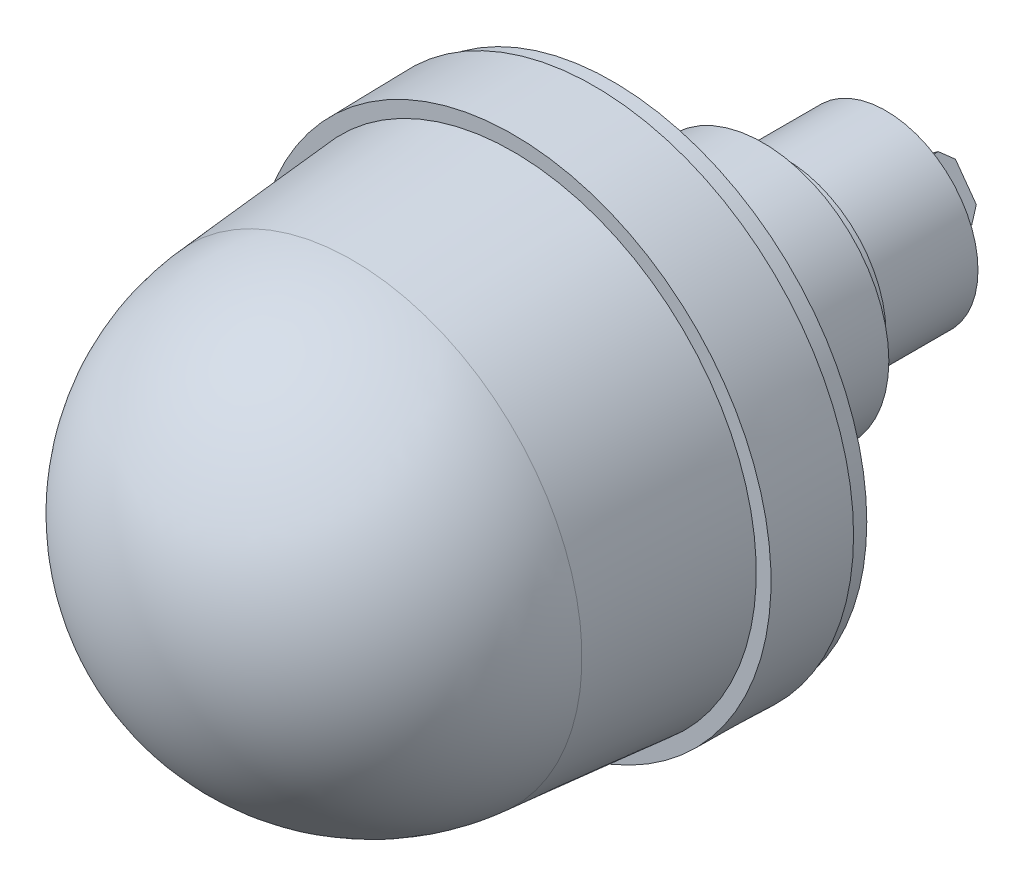
ISO-10303-21;
HEADER;
FILE_DESCRIPTION(('STEP AP214'),'2;1');
FILE_NAME('part.step','',(''),(''),'','','');
FILE_SCHEMA(('AUTOMOTIVE_DESIGN { 1 0 10303 214 1 1 1 1 }'));
ENDSEC;
DATA;
#1=APPLICATION_CONTEXT('core data for automotive mechanical design processes');
#2=APPLICATION_PROTOCOL_DEFINITION('international standard','automotive_design',2000,#1);
#3=PRODUCT_CONTEXT('',#1,'mechanical');
#4=PRODUCT('Part','Part','',(#3));
#5=PRODUCT_RELATED_PRODUCT_CATEGORY('part','',(#4));
#6=PRODUCT_DEFINITION_FORMATION('','',#4);
#7=PRODUCT_DEFINITION_CONTEXT('part definition',#1,'design');
#8=PRODUCT_DEFINITION('design','',#6,#7);
#9=PRODUCT_DEFINITION_SHAPE('','',#8);
#10=(LENGTH_UNIT() NAMED_UNIT(*) SI_UNIT(.MILLI.,.METRE.));
#11=(NAMED_UNIT(*) PLANE_ANGLE_UNIT() SI_UNIT($,.RADIAN.));
#12=(NAMED_UNIT(*) SI_UNIT($,.STERADIAN.) SOLID_ANGLE_UNIT());
#13=UNCERTAINTY_MEASURE_WITH_UNIT(LENGTH_MEASURE(1.E-05),#10,'distance_accuracy_value','');
#14=(GEOMETRIC_REPRESENTATION_CONTEXT(3) GLOBAL_UNCERTAINTY_ASSIGNED_CONTEXT((#13)) GLOBAL_UNIT_ASSIGNED_CONTEXT((#10,
#11,#12)) REPRESENTATION_CONTEXT('',''));
#15=CARTESIAN_POINT('',(0.,0.,0.));
#16=DIRECTION('',(0.,0.,1.));
#17=DIRECTION('',(1.,0.,0.));
#18=AXIS2_PLACEMENT_3D('',#15,#16,#17);
#19=CARTESIAN_POINT('',(0.,5.05,-29.));
#20=DIRECTION('',(0.,0.,-1.));
#21=DIRECTION('',(-1.,0.,0.));
#22=AXIS2_PLACEMENT_3D('',#19,#20,#21);
#23=PLANE('',#22);
#24=CARTESIAN_POINT('',(0.,0.,-29.));
#25=DIRECTION('',(0.,0.,1.));
#26=DIRECTION('',(1.,0.,0.));
#27=AXIS2_PLACEMENT_3D('',#24,#25,#26);
#28=CIRCLE('',#27,10.1);
#29=CARTESIAN_POINT('',(10.1,0.,-29.));
#30=VERTEX_POINT('',#29);
#31=EDGE_CURVE('E237',#30,#30,#28,.T.);
#32=ORIENTED_EDGE('',*,*,#31,.F.);
#33=EDGE_LOOP('',(#32));
#34=FACE_BOUND('',#33,.T.);
#35=DIRECTION('',(0.585540483323654,-0.810643165880711,0.));
#36=VECTOR('',#35,1.);
#37=CARTESIAN_POINT('',(-3.76949072134531,-2.72276324745501,-29.));
#38=LINE('',#37,#36);
#39=CARTESIAN_POINT('',(-5.61394324381483,-0.16923727493077,-29.));
#40=VERTEX_POINT('',#39);
#41=CARTESIAN_POINT('',(-1.92503819887581,-5.27628921997925,-29.));
#42=VERTEX_POINT('',#41);
#43=EDGE_CURVE('E172',#40,#42,#38,.T.);
#44=ORIENTED_EDGE('',*,*,#43,.T.);
#45=DIRECTION('',(0.810643165880711,0.585540483323654,0.));
#46=VECTOR('',#45,1.);
#47=CARTESIAN_POINT('',(-1.60078093252352,-5.04207302664979,-29.));
#48=LINE('',#47,#46);
#49=CARTESIAN_POINT('',(-1.27652366617123,-4.80785683332033,-29.));
#50=VERTEX_POINT('',#49);
#51=EDGE_CURVE('E168',#42,#50,#48,.T.);
#52=ORIENTED_EDGE('',*,*,#51,.T.);
#53=DIRECTION('',(-0.585540483323654,0.810643165880711,0.));
#54=VECTOR('',#53,1.);
#55=CARTESIAN_POINT('',(-3.12097618864074,-2.25433086079609,-29.));
#56=LINE('',#55,#54);
#57=CARTESIAN_POINT('',(-4.96542871111025,0.299195111728155,-29.));
#58=VERTEX_POINT('',#57);
#59=EDGE_CURVE('E181',#50,#58,#56,.T.);
#60=ORIENTED_EDGE('',*,*,#59,.T.);
#61=DIRECTION('',(-0.810643165880711,-0.585540483323654,0.));
#62=VECTOR('',#61,1.);
#63=CARTESIAN_POINT('',(-5.28968597746254,0.0649789183986918,-29.));
#64=LINE('',#63,#62);
#65=EDGE_CURVE('E177',#58,#40,#64,.T.);
#66=ORIENTED_EDGE('',*,*,#65,.T.);
#67=EDGE_LOOP('',(#44,#52,#60,#66));
#68=FACE_BOUND('',#67,.T.);
#69=DIRECTION('',(0.810643165880711,0.585540483323654,0.));
#70=VECTOR('',#69,1.);
#71=CARTESIAN_POINT('',(1.60078093252353,5.04207302664977,-29.));
#72=LINE('',#71,#70);
#73=CARTESIAN_POINT('',(1.27652366617125,4.80785683332031,-29.));
#74=VERTEX_POINT('',#73);
#75=CARTESIAN_POINT('',(1.92503819887582,5.27628921997923,-29.));
#76=VERTEX_POINT('',#75);
#77=EDGE_CURVE('E138',#74,#76,#72,.T.);
#78=ORIENTED_EDGE('',*,*,#77,.F.);
#79=DIRECTION('',(-0.585540483323654,0.810643165880711,0.));
#80=VECTOR('',#79,1.);
#81=CARTESIAN_POINT('',(3.12097618864076,2.25433086079607,-29.));
#82=LINE('',#81,#80);
#83=CARTESIAN_POINT('',(4.96542871111027,-0.299195111728172,-29.));
#84=VERTEX_POINT('',#83);
#85=EDGE_CURVE('E118',#84,#74,#82,.T.);
#86=ORIENTED_EDGE('',*,*,#85,.F.);
#87=DIRECTION('',(-0.810643165880711,-0.585540483323654,0.));
#88=VECTOR('',#87,1.);
#89=CARTESIAN_POINT('',(5.28968597746255,-0.064978918398709,-29.));
#90=LINE('',#89,#88);
#91=CARTESIAN_POINT('',(5.61394324381484,0.169237274930753,-29.));
#92=VERTEX_POINT('',#91);
#93=EDGE_CURVE('E125',#92,#84,#90,.T.);
#94=ORIENTED_EDGE('',*,*,#93,.F.);
#95=DIRECTION('',(0.585540483323654,-0.810643165880711,0.));
#96=VECTOR('',#95,1.);
#97=CARTESIAN_POINT('',(3.76949072134533,2.72276324745499,-29.));
#98=LINE('',#97,#96);
#99=EDGE_CURVE('E135',#76,#92,#98,.T.);
#100=ORIENTED_EDGE('',*,*,#99,.F.);
#101=EDGE_LOOP('',(#78,#86,#94,#100));
#102=FACE_BOUND('',#101,.T.);
#103=ADVANCED_FACE('F17',(#34,#68,#102),#23,.T.);
#104=CARTESIAN_POINT('',(0.,14.2249999999556,2.99999999999835));
#105=DIRECTION('',(0.,0.,1.));
#106=DIRECTION('',(1.,0.,0.));
#107=AXIS2_PLACEMENT_3D('',#104,#105,#106);
#108=PLANE('',#107);
#109=CARTESIAN_POINT('',(0.,0.,2.99999999999835));
#110=DIRECTION('',(0.,0.,1.));
#111=DIRECTION('',(1.,0.,0.));
#112=AXIS2_PLACEMENT_3D('',#109,#110,#111);
#113=CIRCLE('',#112,27.9);
#114=CARTESIAN_POINT('',(27.9,0.,2.99999999999835));
#115=VERTEX_POINT('',#114);
#116=EDGE_CURVE('E241',#115,#115,#113,.T.);
#117=ORIENTED_EDGE('',*,*,#116,.T.);
#118=EDGE_LOOP('',(#117));
#119=FACE_BOUND('',#118,.T.);
#120=CARTESIAN_POINT('',(0.,0.,2.99999999999835));
#121=DIRECTION('',(0.,0.,-1.));
#122=DIRECTION('',(-1.,0.,0.));
#123=AXIS2_PLACEMENT_3D('',#120,#121,#122);
#124=CIRCLE('',#123,28.4499999999113);
#125=CARTESIAN_POINT('',(-28.4499999999113,0.,2.99999999999835));
#126=VERTEX_POINT('',#125);
#127=EDGE_CURVE('E257',#126,#126,#124,.T.);
#128=ORIENTED_EDGE('',*,*,#127,.T.);
#129=EDGE_LOOP('',(#128));
#130=FACE_BOUND('',#129,.T.);
#131=ADVANCED_FACE('F334',(#119,#130),#108,.F.);
#132=CARTESIAN_POINT('',(0.,0.,11.8999999999291));
#133=DIRECTION('',(0.,0.,-1.));
#134=DIRECTION('',(-1.,0.,0.));
#135=AXIS2_PLACEMENT_3D('',#132,#133,#134);
#136=CONICAL_SURFACE('',#135,28.2946499221511,0.0174532925087362);
#137=ORIENTED_EDGE('',*,*,#127,.F.);
#138=EDGE_LOOP('',(#137));
#139=FACE_BOUND('',#138,.T.);
#140=CARTESIAN_POINT('',(0.,0.,11.8999999999291));
#141=DIRECTION('',(0.,0.,-1.));
#142=DIRECTION('',(-1.,0.,0.));
#143=AXIS2_PLACEMENT_3D('',#140,#141,#142);
#144=CIRCLE('',#143,28.2946499221511);
#145=CARTESIAN_POINT('',(-28.2946499221511,0.,11.8999999999291));
#146=VERTEX_POINT('',#145);
#147=EDGE_CURVE('E253',#146,#146,#144,.T.);
#148=ORIENTED_EDGE('',*,*,#147,.T.);
#149=EDGE_LOOP('',(#148));
#150=FACE_BOUND('',#149,.T.);
#151=ADVANCED_FACE('F341',(#139,#150),#136,.T.);
#152=CARTESIAN_POINT('',(0.,27.4848249606536,11.8999999999291));
#153=DIRECTION('',(0.,0.,-1.));
#154=DIRECTION('',(-1.,0.,0.));
#155=AXIS2_PLACEMENT_3D('',#152,#153,#154);
#156=PLANE('',#155);
#157=ORIENTED_EDGE('',*,*,#147,.F.);
#158=EDGE_LOOP('',(#157));
#159=FACE_BOUND('',#158,.T.);
#160=CARTESIAN_POINT('',(0.,0.,11.8999999999291));
#161=DIRECTION('',(0.,0.,-1.));
#162=DIRECTION('',(-1.,0.,0.));
#163=AXIS2_PLACEMENT_3D('',#160,#161,#162);
#164=CIRCLE('',#163,26.6749999991561);
#165=CARTESIAN_POINT('',(-26.6749999991561,0.,11.8999999999291));
#166=VERTEX_POINT('',#165);
#167=EDGE_CURVE('E249',#166,#166,#164,.T.);
#168=ORIENTED_EDGE('',*,*,#167,.T.);
#169=EDGE_LOOP('',(#168));
#170=FACE_BOUND('',#169,.T.);
#171=ADVANCED_FACE('F361',(#159,#170),#156,.F.);
#172=CARTESIAN_POINT('',(0.,0.,29.5326089875493));
#173=DIRECTION('',(0.,0.,-1.));
#174=DIRECTION('',(-1.,0.,0.));
#175=AXIS2_PLACEMENT_3D('',#172,#173,#174);
#176=CONICAL_SURFACE('',#175,25.1821970036568,0.084460085717178);
#177=ORIENTED_EDGE('',*,*,#167,.F.);
#178=EDGE_LOOP('',(#177));
#179=FACE_BOUND('',#178,.T.);
#180=CARTESIAN_POINT('',(0.,0.,29.5326089875493));
#181=DIRECTION('',(0.,0.,-1.));
#182=DIRECTION('',(-1.,0.,0.));
#183=AXIS2_PLACEMENT_3D('',#180,#181,#182);
#184=CIRCLE('',#183,25.1821970036568);
#185=CARTESIAN_POINT('',(-25.1821970036568,0.,29.5326089875493));
#186=VERTEX_POINT('',#185);
#187=EDGE_CURVE('E245',#186,#186,#184,.T.);
#188=ORIENTED_EDGE('',*,*,#187,.T.);
#189=EDGE_LOOP('',(#188));
#190=FACE_BOUND('',#189,.T.);
#191=ADVANCED_FACE('F357',(#179,#190),#176,.T.);
#192=CARTESIAN_POINT('',(0.0294772823733194,0.,27.3981510112985));
#193=DIRECTION('',(0.,-1.,0.));
#194=DIRECTION('',(-1.,0.,0.));
#195=AXIS2_PLACEMENT_3D('',#192,#193,#194);
#196=CIRCLE('',#195,25.3018661595791);
#197=TRIMMED_CURVE('',#196,(PARAMETER_VALUE(-1.56963130248975)),
(PARAMETER_VALUE(1.56963130248975)),.T.,.PARAMETER.);
#198=CARTESIAN_POINT('',(0.,0.,27.3981510112985));
#199=DIRECTION('',(0.,0.,-1.));
#200=AXIS1_PLACEMENT('',#198,#199);
#201=SURFACE_OF_REVOLUTION('',#197,#200);
#202=CARTESIAN_POINT('',(0.,0.,52.7));
#203=VERTEX_POINT('',#202);
#204=VERTEX_LOOP('',#203);
#205=FACE_BOUND('',#204,.T.);
#206=ORIENTED_EDGE('',*,*,#187,.F.);
#207=EDGE_LOOP('',(#206));
#208=FACE_BOUND('',#207,.T.);
#209=ADVANCED_FACE('F353',(#205,#208),#201,.T.);
#210=CARTESIAN_POINT('',(0.,0.,-13.0000000000008));
#211=DIRECTION('',(0.,0.,1.));
#212=DIRECTION('',(1.,0.,0.));
#213=AXIS2_PLACEMENT_3D('',#210,#211,#212);
#214=CYLINDRICAL_SURFACE('',#213,27.9);
#215=CARTESIAN_POINT('',(0.,0.,1.));
#216=DIRECTION('',(0.,0.,1.));
#217=DIRECTION('',(1.,0.,0.));
#218=AXIS2_PLACEMENT_3D('',#215,#216,#217);
#219=CIRCLE('',#218,27.9);
#220=CARTESIAN_POINT('',(27.9,0.,1.));
#221=VERTEX_POINT('',#220);
#222=EDGE_CURVE('E185',#221,#221,#219,.T.);
#223=ORIENTED_EDGE('',*,*,#222,.T.);
#224=EDGE_LOOP('',(#223));
#225=FACE_BOUND('',#224,.T.);
#226=ORIENTED_EDGE('',*,*,#116,.F.);
#227=EDGE_LOOP('',(#226));
#228=FACE_BOUND('',#227,.T.);
#229=ADVANCED_FACE('F350',(#225,#228),#214,.T.);
#230=CARTESIAN_POINT('',(0.,0.,-13.0000000000008));
#231=DIRECTION('',(0.,0.,1.));
#232=DIRECTION('',(1.,0.,0.));
#233=AXIS2_PLACEMENT_3D('',#230,#231,#232);
#234=CYLINDRICAL_SURFACE('',#233,10.1000000002019);
#235=ORIENTED_EDGE('',*,*,#31,.T.);
#236=EDGE_LOOP('',(#235));
#237=FACE_BOUND('',#236,.T.);
#238=CARTESIAN_POINT('',(0.,0.,-18.0000000004038));
#239=DIRECTION('',(0.,0.,1.));
#240=DIRECTION('',(1.,0.,0.));
#241=AXIS2_PLACEMENT_3D('',#238,#239,#240);
#242=CIRCLE('',#241,10.1000000004038);
#243=CARTESIAN_POINT('',(10.1000000004038,0.,-18.0000000004038));
#244=VERTEX_POINT('',#243);
#245=EDGE_CURVE('E233',#244,#244,#242,.T.);
#246=ORIENTED_EDGE('',*,*,#245,.F.);
#247=EDGE_LOOP('',(#246));
#248=FACE_BOUND('',#247,.T.);
#249=ADVANCED_FACE('F348',(#237,#248),#234,.T.);
#250=CARTESIAN_POINT('',(0.,10.5500000002019,-18.0000000004038));
#251=DIRECTION('',(0.,0.,-1.));
#252=DIRECTION('',(-1.,0.,0.));
#253=AXIS2_PLACEMENT_3D('',#250,#251,#252);
#254=PLANE('',#253);
#255=ORIENTED_EDGE('',*,*,#245,.T.);
#256=EDGE_LOOP('',(#255));
#257=FACE_BOUND('',#256,.T.);
#258=CARTESIAN_POINT('',(0.,0.,-18.0000000004038));
#259=DIRECTION('',(0.,0.,1.));
#260=DIRECTION('',(1.,0.,0.));
#261=AXIS2_PLACEMENT_3D('',#258,#259,#260);
#262=CIRCLE('',#261,11.);
#263=CARTESIAN_POINT('',(11.,0.,-18.0000000004038));
#264=VERTEX_POINT('',#263);
#265=EDGE_CURVE('E229',#264,#264,#262,.T.);
#266=ORIENTED_EDGE('',*,*,#265,.F.);
#267=EDGE_LOOP('',(#266));
#268=FACE_BOUND('',#267,.T.);
#269=ADVANCED_FACE('F452',(#257,#268),#254,.T.);
#270=CARTESIAN_POINT('',(0.,0.,-13.0000000000008));
#271=DIRECTION('',(0.,0.,1.));
#272=DIRECTION('',(1.,0.,0.));
#273=AXIS2_PLACEMENT_3D('',#270,#271,#272);
#274=CYLINDRICAL_SURFACE('',#273,11.);
#275=ORIENTED_EDGE('',*,*,#265,.T.);
#276=EDGE_LOOP('',(#275));
#277=FACE_BOUND('',#276,.T.);
#278=CARTESIAN_POINT('',(0.,0.,-15.5));
#279=DIRECTION('',(0.,0.,1.));
#280=DIRECTION('',(1.,0.,0.));
#281=AXIS2_PLACEMENT_3D('',#278,#279,#280);
#282=CIRCLE('',#281,11.);
#283=CARTESIAN_POINT('',(11.,0.,-15.5));
#284=VERTEX_POINT('',#283);
#285=EDGE_CURVE('E225',#284,#284,#282,.T.);
#286=ORIENTED_EDGE('',*,*,#285,.F.);
#287=EDGE_LOOP('',(#286));
#288=FACE_BOUND('',#287,.T.);
#289=ADVANCED_FACE('F449',(#277,#288),#274,.T.);
#290=CARTESIAN_POINT('',(0.,12.4098214285714,-15.5));
#291=DIRECTION('',(0.,0.,-1.));
#292=DIRECTION('',(-1.,0.,0.));
#293=AXIS2_PLACEMENT_3D('',#290,#291,#292);
#294=PLANE('',#293);
#295=ORIENTED_EDGE('',*,*,#285,.T.);
#296=EDGE_LOOP('',(#295));
#297=FACE_BOUND('',#296,.T.);
#298=CARTESIAN_POINT('',(0.,0.,-15.5));
#299=DIRECTION('',(0.,0.,1.));
#300=DIRECTION('',(1.,0.,0.));
#301=AXIS2_PLACEMENT_3D('',#298,#299,#300);
#302=CIRCLE('',#301,13.8196428571428);
#303=CARTESIAN_POINT('',(13.8196428571428,0.,-15.5));
#304=VERTEX_POINT('',#303);
#305=EDGE_CURVE('E222',#304,#304,#302,.T.);
#306=ORIENTED_EDGE('',*,*,#305,.F.);
#307=EDGE_LOOP('',(#306));
#308=FACE_BOUND('',#307,.T.);
#309=ADVANCED_FACE('F445',(#297,#308),#294,.T.);
#310=CARTESIAN_POINT('',(0.,0.,-7.));
#311=DIRECTION('',(0.,0.,1.));
#312=DIRECTION('',(1.,0.,0.));
#313=AXIS2_PLACEMENT_3D('',#310,#311,#312);
#314=CONICAL_SURFACE('',#313,13.8500000000001,0.00357141338691907);
#315=ORIENTED_EDGE('',*,*,#305,.T.);
#316=EDGE_LOOP('',(#315));
#317=FACE_BOUND('',#316,.T.);
#318=CARTESIAN_POINT('',(0.,0.,-7.));
#319=DIRECTION('',(0.,0.,1.));
#320=DIRECTION('',(1.,0.,0.));
#321=AXIS2_PLACEMENT_3D('',#318,#319,#320);
#322=CIRCLE('',#321,13.8500000000001);
#323=CARTESIAN_POINT('',(13.8500000000001,0.,-7.));
#324=VERTEX_POINT('',#323);
#325=EDGE_CURVE('E218',#324,#324,#322,.T.);
#326=ORIENTED_EDGE('',*,*,#325,.F.);
#327=EDGE_LOOP('',(#326));
#328=FACE_BOUND('',#327,.T.);
#329=ADVANCED_FACE('F441',(#317,#328),#314,.T.);
#330=CARTESIAN_POINT('',(0.,12.425,-7.));
#331=DIRECTION('',(0.,0.,1.));
#332=DIRECTION('',(1.,0.,0.));
#333=AXIS2_PLACEMENT_3D('',#330,#331,#332);
#334=PLANE('',#333);
#335=ORIENTED_EDGE('',*,*,#325,.T.);
#336=EDGE_LOOP('',(#335));
#337=FACE_BOUND('',#336,.T.);
#338=CARTESIAN_POINT('',(0.,0.,-7.));
#339=DIRECTION('',(0.,0.,1.));
#340=DIRECTION('',(1.,0.,0.));
#341=AXIS2_PLACEMENT_3D('',#338,#339,#340);
#342=CIRCLE('',#341,11.);
#343=CARTESIAN_POINT('',(11.,0.,-7.));
#344=VERTEX_POINT('',#343);
#345=EDGE_CURVE('E214',#344,#344,#342,.T.);
#346=ORIENTED_EDGE('',*,*,#345,.F.);
#347=EDGE_LOOP('',(#346));
#348=FACE_BOUND('',#347,.T.);
#349=ADVANCED_FACE('F437',(#337,#348),#334,.T.);
#350=CARTESIAN_POINT('',(0.,0.,-13.0000000000008));
#351=DIRECTION('',(0.,0.,1.));
#352=DIRECTION('',(1.,0.,0.));
#353=AXIS2_PLACEMENT_3D('',#350,#351,#352);
#354=CYLINDRICAL_SURFACE('',#353,11.);
#355=ORIENTED_EDGE('',*,*,#345,.T.);
#356=EDGE_LOOP('',(#355));
#357=FACE_BOUND('',#356,.T.);
#358=CARTESIAN_POINT('',(0.,0.,0.));
#359=DIRECTION('',(0.,0.,1.));
#360=DIRECTION('',(1.,0.,0.));
#361=AXIS2_PLACEMENT_3D('',#358,#359,#360);
#362=CIRCLE('',#361,11.);
#363=CARTESIAN_POINT('',(11.,0.,0.));
#364=VERTEX_POINT('',#363);
#365=EDGE_CURVE('E210',#364,#364,#362,.T.);
#366=ORIENTED_EDGE('',*,*,#365,.F.);
#367=EDGE_LOOP('',(#366));
#368=FACE_BOUND('',#367,.T.);
#369=ADVANCED_FACE('F433',(#357,#368),#354,.T.);
#370=CARTESIAN_POINT('',(0.,15.5,0.));
#371=DIRECTION('',(0.,0.,-1.));
#372=DIRECTION('',(-1.,0.,0.));
#373=AXIS2_PLACEMENT_3D('',#370,#371,#372);
#374=PLANE('',#373);
#375=ORIENTED_EDGE('',*,*,#365,.T.);
#376=EDGE_LOOP('',(#375));
#377=FACE_BOUND('',#376,.T.);
#378=CARTESIAN_POINT('',(0.,0.,0.));
#379=DIRECTION('',(0.,0.,1.));
#380=DIRECTION('',(1.,0.,0.));
#381=AXIS2_PLACEMENT_3D('',#378,#379,#380);
#382=CIRCLE('',#381,20.);
#383=CARTESIAN_POINT('',(20.,0.,0.));
#384=VERTEX_POINT('',#383);
#385=EDGE_CURVE('E206',#384,#384,#382,.T.);
#386=ORIENTED_EDGE('',*,*,#385,.F.);
#387=EDGE_LOOP('',(#386));
#388=FACE_BOUND('',#387,.T.);
#389=ADVANCED_FACE('F429',(#377,#388),#374,.T.);
#390=CARTESIAN_POINT('',(0.,0.,-13.0000000000008));
#391=DIRECTION('',(0.,0.,1.));
#392=DIRECTION('',(1.,0.,0.));
#393=AXIS2_PLACEMENT_3D('',#390,#391,#392);
#394=CYLINDRICAL_SURFACE('',#393,20.);
#395=ORIENTED_EDGE('',*,*,#385,.T.);
#396=EDGE_LOOP('',(#395));
#397=FACE_BOUND('',#396,.T.);
#398=CARTESIAN_POINT('',(0.,0.,1.));
#399=DIRECTION('',(0.,0.,1.));
#400=DIRECTION('',(1.,0.,0.));
#401=AXIS2_PLACEMENT_3D('',#398,#399,#400);
#402=CIRCLE('',#401,20.);
#403=CARTESIAN_POINT('',(20.,0.,1.));
#404=VERTEX_POINT('',#403);
#405=EDGE_CURVE('E202',#404,#404,#402,.T.);
#406=ORIENTED_EDGE('',*,*,#405,.F.);
#407=EDGE_LOOP('',(#406));
#408=FACE_BOUND('',#407,.T.);
#409=ADVANCED_FACE('F415',(#397,#408),#394,.T.);
#410=CARTESIAN_POINT('',(0.,23.95,1.));
#411=DIRECTION('',(0.,0.,-1.));
#412=DIRECTION('',(-1.,0.,0.));
#413=AXIS2_PLACEMENT_3D('',#410,#411,#412);
#414=PLANE('',#413);
#415=ORIENTED_EDGE('',*,*,#405,.T.);
#416=EDGE_LOOP('',(#415));
#417=FACE_BOUND('',#416,.T.);
#418=ORIENTED_EDGE('',*,*,#222,.F.);
#419=EDGE_LOOP('',(#418));
#420=FACE_BOUND('',#419,.T.);
#421=ADVANCED_FACE('F408',(#417,#420),#414,.T.);
#422=CARTESIAN_POINT('',(-3.44523345499303,-2.48854705412554,-33.9999999999967));
#423=DIRECTION('',(0.,0.,-1.));
#424=DIRECTION('',(0.,1.,0.));
#425=AXIS2_PLACEMENT_3D('',#422,#423,#424);
#426=PLANE('',#425);
#427=DIRECTION('',(0.585540483323654,-0.810643165880711,0.));
#428=VECTOR('',#427,1.);
#429=CARTESIAN_POINT('',(-3.76949072134531,-2.72276324745501,-33.9999999999967));
#430=LINE('',#429,#428);
#431=CARTESIAN_POINT('',(-4.91492501482305,-1.13698308635916,-33.9999999999967));
#432=VERTEX_POINT('',#431);
#433=CARTESIAN_POINT('',(-2.62405642786759,-4.30854340855086,-33.9999999999967));
#434=VERTEX_POINT('',#433);
#435=EDGE_CURVE('E140',#432,#434,#430,.T.);
#436=ORIENTED_EDGE('',*,*,#435,.F.);
#437=DIRECTION('',(0.810643165880711,0.585540483323654,0.));
#438=VECTOR('',#437,1.);
#439=CARTESIAN_POINT('',(-4.59066774847076,-0.9027668930297,-33.9999999999967));
#440=LINE('',#439,#438);
#441=CARTESIAN_POINT('',(-4.26641048211847,-0.668550699700239,-33.9999999999967));
#442=VERTEX_POINT('',#441);
#443=EDGE_CURVE('E41',#432,#442,#440,.T.);
#444=ORIENTED_EDGE('',*,*,#443,.T.);
#445=DIRECTION('',(-0.585540483323654,0.810643165880711,0.));
#446=VECTOR('',#445,1.);
#447=CARTESIAN_POINT('',(-3.12097618864074,-2.25433086079609,-33.9999999999967));
#448=LINE('',#447,#446);
#449=CARTESIAN_POINT('',(-1.97554189516301,-3.84011102189194,-33.9999999999967));
#450=VERTEX_POINT('',#449);
#451=EDGE_CURVE('E147',#450,#442,#448,.T.);
#452=ORIENTED_EDGE('',*,*,#451,.F.);
#453=DIRECTION('',(-0.810643165880711,-0.585540483323654,0.));
#454=VECTOR('',#453,1.);
#455=CARTESIAN_POINT('',(-2.2997991615153,-4.0743272152214,-33.9999999999967));
#456=LINE('',#455,#454);
#457=EDGE_CURVE('E293',#450,#434,#456,.T.);
#458=ORIENTED_EDGE('',*,*,#457,.T.);
#459=EDGE_LOOP('',(#436,#444,#452,#458));
#460=FACE_BOUND('',#459,.T.);
#461=ADVANCED_FACE('F331',(#460),#426,.T.);
#462=CARTESIAN_POINT('',(-3.76949072134531,-2.72276324745501,-34.0019999999967));
#463=DIRECTION('',(-0.810643165880711,-0.585540483323654,0.));
#464=DIRECTION('',(0.585540483323654,-0.810643165880711,0.));
#465=AXIS2_PLACEMENT_3D('',#462,#463,#464);
#466=PLANE('',#465);
#467=DIRECTION('',(0.,0.,1.));
#468=VECTOR('',#467,1.);
#469=CARTESIAN_POINT('',(-5.61394324381483,-0.16923727493077,-34.0019999999967));
#470=LINE('',#469,#468);
#471=CARTESIAN_POINT('',(-5.61394324381483,-0.16923727493077,-32.8061999999967));
#472=VERTEX_POINT('',#471);
#473=EDGE_CURVE('E191',#472,#40,#470,.T.);
#474=ORIENTED_EDGE('',*,*,#473,.F.);
#475=DIRECTION('',(-0.414039646417404,0.573211279716782,0.707106781186548));
#476=VECTOR('',#475,1.);
#477=CARTESIAN_POINT('',(-4.34162232760085,-1.93068381007297,-34.9790999999967));
#478=LINE('',#477,#476);
#479=EDGE_CURVE('E290',#472,#432,#478,.F.);
#480=ORIENTED_EDGE('',*,*,#479,.T.);
#481=ORIENTED_EDGE('',*,*,#435,.T.);
#482=DIRECTION('',(-0.414039646417404,0.573211279716782,-0.707106781186548));
#483=VECTOR('',#482,1.);
#484=CARTESIAN_POINT('',(-3.19735911508977,-3.51484268483705,-34.9790999999967));
#485=LINE('',#484,#483);
#486=CARTESIAN_POINT('',(-1.92503819887581,-5.27628921997925,-32.8061999999967));
#487=VERTEX_POINT('',#486);
#488=EDGE_CURVE('E287',#434,#487,#485,.F.);
#489=ORIENTED_EDGE('',*,*,#488,.T.);
#490=DIRECTION('',(0.,0.,1.));
#491=VECTOR('',#490,1.);
#492=CARTESIAN_POINT('',(-1.92503819887581,-5.27628921997925,-34.0019999999967));
#493=LINE('',#492,#491);
#494=EDGE_CURVE('E187',#487,#42,#493,.T.);
#495=ORIENTED_EDGE('',*,*,#494,.T.);
#496=ORIENTED_EDGE('',*,*,#43,.F.);
#497=EDGE_LOOP('',(#474,#480,#481,#489,#495,#496));
#498=FACE_BOUND('',#497,.T.);
#499=ADVANCED_FACE('F392',(#498),#466,.T.);
#500=CARTESIAN_POINT('',(-5.28968597746254,0.0649789183986918,-34.0019999999967));
#501=DIRECTION('',(-0.585540483323654,0.810643165880711,0.));
#502=DIRECTION('',(-0.810643165880711,-0.585540483323654,0.));
#503=AXIS2_PLACEMENT_3D('',#500,#501,#502);
#504=PLANE('',#503);
#505=DIRECTION('',(0.,0.,1.));
#506=VECTOR('',#505,1.);
#507=CARTESIAN_POINT('',(-4.96542871111025,0.299195111728155,-34.0019999999967));
#508=LINE('',#507,#506);
#509=CARTESIAN_POINT('',(-4.96542871111025,0.299195111728155,-32.8061999999967));
#510=VERTEX_POINT('',#509);
#511=EDGE_CURVE('E194',#510,#58,#508,.T.);
#512=ORIENTED_EDGE('',*,*,#511,.F.);
#513=DIRECTION('',(-0.810643165880711,-0.585540483323654,0.));
#514=VECTOR('',#513,1.);
#515=CARTESIAN_POINT('',(-5.28968597746254,0.0649789183986918,-32.8061999999967));
#516=LINE('',#515,#514);
#517=EDGE_CURVE('E283',#510,#472,#516,.T.);
#518=ORIENTED_EDGE('',*,*,#517,.T.);
#519=ORIENTED_EDGE('',*,*,#473,.T.);
#520=ORIENTED_EDGE('',*,*,#65,.F.);
#521=EDGE_LOOP('',(#512,#518,#519,#520));
#522=FACE_BOUND('',#521,.T.);
#523=ADVANCED_FACE('F402',(#522),#504,.T.);
#524=CARTESIAN_POINT('',(-1.60078093252352,-5.04207302664979,-34.0019999999967));
#525=DIRECTION('',(0.585540483323654,-0.810643165880711,0.));
#526=DIRECTION('',(0.810643165880711,0.585540483323654,0.));
#527=AXIS2_PLACEMENT_3D('',#524,#525,#526);
#528=PLANE('',#527);
#529=ORIENTED_EDGE('',*,*,#494,.F.);
#530=DIRECTION('',(0.810643165880711,0.585540483323654,0.));
#531=VECTOR('',#530,1.);
#532=CARTESIAN_POINT('',(-1.60078093252352,-5.04207302664979,-32.8061999999967));
#533=LINE('',#532,#531);
#534=CARTESIAN_POINT('',(-1.27652366617123,-4.80785683332033,-32.8061999999967));
#535=VERTEX_POINT('',#534);
#536=EDGE_CURVE('E11',#487,#535,#533,.T.);
#537=ORIENTED_EDGE('',*,*,#536,.T.);
#538=DIRECTION('',(0.,0.,1.));
#539=VECTOR('',#538,1.);
#540=CARTESIAN_POINT('',(-1.27652366617123,-4.80785683332033,-34.0019999999967));
#541=LINE('',#540,#539);
#542=EDGE_CURVE('E173',#535,#50,#541,.T.);
#543=ORIENTED_EDGE('',*,*,#542,.T.);
#544=ORIENTED_EDGE('',*,*,#51,.F.);
#545=EDGE_LOOP('',(#529,#537,#543,#544));
#546=FACE_BOUND('',#545,.T.);
#547=ADVANCED_FACE('F396',(#546),#528,.T.);
#548=CARTESIAN_POINT('',(-3.12097618864074,-2.25433086079609,-34.0019999999967));
#549=DIRECTION('',(0.810643165880711,0.585540483323654,0.));
#550=DIRECTION('',(-0.585540483323654,0.810643165880711,0.));
#551=AXIS2_PLACEMENT_3D('',#548,#549,#550);
#552=PLANE('',#551);
#553=ORIENTED_EDGE('',*,*,#451,.T.);
#554=DIRECTION('',(0.414039646417404,-0.573211279716782,-0.707106781186548));
#555=VECTOR('',#554,1.);
#556=CARTESIAN_POINT('',(-3.69310779489629,-1.46225142341404,-34.9790999999967));
#557=LINE('',#556,#555);
#558=EDGE_CURVE('E300',#442,#510,#557,.F.);
#559=ORIENTED_EDGE('',*,*,#558,.T.);
#560=ORIENTED_EDGE('',*,*,#511,.T.);
#561=ORIENTED_EDGE('',*,*,#59,.F.);
#562=ORIENTED_EDGE('',*,*,#542,.F.);
#563=DIRECTION('',(0.414039646417404,-0.573211279716782,0.707106781186548));
#564=VECTOR('',#563,1.);
#565=CARTESIAN_POINT('',(-2.5488445823852,-3.04641029817813,-34.9790999999967));
#566=LINE('',#565,#564);
#567=EDGE_CURVE('E34',#535,#450,#566,.F.);
#568=ORIENTED_EDGE('',*,*,#567,.T.);
#569=EDGE_LOOP('',(#553,#559,#560,#561,#562,#568));
#570=FACE_BOUND('',#569,.T.);
#571=ADVANCED_FACE('F406',(#570),#552,.T.);
#572=CARTESIAN_POINT('',(-3.44523345499303,-2.48854705412554,-33.9999999999967));
#573=DIRECTION('',(0.,0.,-1.));
#574=DIRECTION('',(0.,1.,0.));
#575=AXIS2_PLACEMENT_3D('',#572,#573,#574);
#576=PLANE('',#575);
#577=DIRECTION('',(-0.585540483323654,0.810643165880711,0.));
#578=VECTOR('',#577,1.);
#579=CARTESIAN_POINT('',(3.12097618864076,2.25433086079607,-33.9999999999967));
#580=LINE('',#579,#578);
#581=CARTESIAN_POINT('',(4.26641048211849,0.66855069970022,-33.9999999999967));
#582=VERTEX_POINT('',#581);
#583=CARTESIAN_POINT('',(1.97554189516302,3.84011102189192,-33.9999999999967));
#584=VERTEX_POINT('',#583);
#585=EDGE_CURVE('E153',#582,#584,#580,.T.);
#586=ORIENTED_EDGE('',*,*,#585,.T.);
#587=DIRECTION('',(0.810643165880711,0.585540483323654,0.));
#588=VECTOR('',#587,1.);
#589=CARTESIAN_POINT('',(2.6240564278676,4.30854340855084,-33.9999999999967));
#590=LINE('',#589,#588);
#591=CARTESIAN_POINT('',(2.6240564278676,4.30854340855084,-33.9999999999967));
#592=VERTEX_POINT('',#591);
#593=EDGE_CURVE('E265',#584,#592,#590,.T.);
#594=ORIENTED_EDGE('',*,*,#593,.T.);
#595=DIRECTION('',(0.585540483323654,-0.810643165880711,0.));
#596=VECTOR('',#595,1.);
#597=CARTESIAN_POINT('',(3.76949072134533,2.72276324745499,-33.9999999999967));
#598=LINE('',#597,#596);
#599=CARTESIAN_POINT('',(4.91492501482306,1.13698308635915,-33.9999999999967));
#600=VERTEX_POINT('',#599);
#601=EDGE_CURVE('E158',#592,#600,#598,.T.);
#602=ORIENTED_EDGE('',*,*,#601,.T.);
#603=DIRECTION('',(-0.810643165880711,-0.585540483323654,0.));
#604=VECTOR('',#603,1.);
#605=CARTESIAN_POINT('',(4.26641048211849,0.668550699700219,-33.9999999999967));
#606=LINE('',#605,#604);
#607=EDGE_CURVE('E261',#600,#582,#606,.T.);
#608=ORIENTED_EDGE('',*,*,#607,.T.);
#609=EDGE_LOOP('',(#586,#594,#602,#608));
#610=FACE_BOUND('',#609,.T.);
#611=ADVANCED_FACE('F311',(#610),#576,.T.);
#612=CARTESIAN_POINT('',(3.12097618864076,2.25433086079607,-34.0019999999967));
#613=DIRECTION('',(0.810643165880711,0.585540483323654,0.));
#614=DIRECTION('',(-0.585540483323654,0.810643165880711,0.));
#615=AXIS2_PLACEMENT_3D('',#612,#613,#614);
#616=PLANE('',#615);
#617=DIRECTION('',(0.,0.,1.));
#618=VECTOR('',#617,1.);
#619=CARTESIAN_POINT('',(1.27652366617125,4.80785683332031,-34.0019999999967));
#620=LINE('',#619,#618);
#621=CARTESIAN_POINT('',(1.27652366617125,4.80785683332031,-32.8061999999967));
#622=VERTEX_POINT('',#621);
#623=EDGE_CURVE('E157',#622,#74,#620,.T.);
#624=ORIENTED_EDGE('',*,*,#623,.F.);
#625=DIRECTION('',(0.414039646417404,-0.573211279716782,-0.707106781186548));
#626=VECTOR('',#625,1.);
#627=CARTESIAN_POINT('',(1.97554189516302,3.84011102189192,-33.9999999999967));
#628=LINE('',#627,#626);
#629=EDGE_CURVE('E280',#622,#584,#628,.T.);
#630=ORIENTED_EDGE('',*,*,#629,.T.);
#631=ORIENTED_EDGE('',*,*,#585,.F.);
#632=DIRECTION('',(0.414039646417403,-0.573211279716781,0.707106781186549));
#633=VECTOR('',#632,1.);
#634=CARTESIAN_POINT('',(4.26641048211849,0.668550699700217,-33.9999999999967));
#635=LINE('',#634,#633);
#636=CARTESIAN_POINT('',(4.96542871111027,-0.299195111728172,-32.8061999999967));
#637=VERTEX_POINT('',#636);
#638=EDGE_CURVE('E121',#582,#637,#635,.T.);
#639=ORIENTED_EDGE('',*,*,#638,.T.);
#640=DIRECTION('',(0.,0.,1.));
#641=VECTOR('',#640,1.);
#642=CARTESIAN_POINT('',(4.96542871111027,-0.299195111728172,-34.0019999999967));
#643=LINE('',#642,#641);
#644=EDGE_CURVE('E113',#637,#84,#643,.T.);
#645=ORIENTED_EDGE('',*,*,#644,.T.);
#646=ORIENTED_EDGE('',*,*,#85,.T.);
#647=EDGE_LOOP('',(#624,#630,#631,#639,#645,#646));
#648=FACE_BOUND('',#647,.T.);
#649=ADVANCED_FACE('F116',(#648),#616,.F.);
#650=CARTESIAN_POINT('',(1.60078093252353,5.04207302664977,-34.0019999999967));
#651=DIRECTION('',(0.585540483323654,-0.810643165880711,0.));
#652=DIRECTION('',(0.810643165880711,0.585540483323654,0.));
#653=AXIS2_PLACEMENT_3D('',#650,#651,#652);
#654=PLANE('',#653);
#655=DIRECTION('',(0.,0.,1.));
#656=VECTOR('',#655,1.);
#657=CARTESIAN_POINT('',(1.92503819887582,5.27628921997923,-34.0019999999967));
#658=LINE('',#657,#656);
#659=CARTESIAN_POINT('',(1.92503819887582,5.27628921997923,-32.8061999999967));
#660=VERTEX_POINT('',#659);
#661=EDGE_CURVE('E163',#660,#76,#658,.T.);
#662=ORIENTED_EDGE('',*,*,#661,.F.);
#663=DIRECTION('',(-0.810643165880711,-0.585540483323654,0.));
#664=VECTOR('',#663,1.);
#665=CARTESIAN_POINT('',(1.27652366617125,4.80785683332031,-32.8061999999967));
#666=LINE('',#665,#664);
#667=EDGE_CURVE('E275',#660,#622,#666,.T.);
#668=ORIENTED_EDGE('',*,*,#667,.T.);
#669=ORIENTED_EDGE('',*,*,#623,.T.);
#670=ORIENTED_EDGE('',*,*,#77,.T.);
#671=EDGE_LOOP('',(#662,#668,#669,#670));
#672=FACE_BOUND('',#671,.T.);
#673=ADVANCED_FACE('F319',(#672),#654,.F.);
#674=CARTESIAN_POINT('',(3.76949072134533,2.72276324745499,-34.0019999999967));
#675=DIRECTION('',(-0.810643165880711,-0.585540483323654,0.));
#676=DIRECTION('',(0.585540483323654,-0.810643165880711,0.));
#677=AXIS2_PLACEMENT_3D('',#674,#675,#676);
#678=PLANE('',#677);
#679=ORIENTED_EDGE('',*,*,#601,.F.);
#680=DIRECTION('',(-0.414039646417404,0.573211279716782,0.707106781186548));
#681=VECTOR('',#680,1.);
#682=CARTESIAN_POINT('',(2.6240564278676,4.30854340855084,-33.9999999999967));
#683=LINE('',#682,#681);
#684=EDGE_CURVE('E272',#592,#660,#683,.T.);
#685=ORIENTED_EDGE('',*,*,#684,.T.);
#686=ORIENTED_EDGE('',*,*,#661,.T.);
#687=ORIENTED_EDGE('',*,*,#99,.T.);
#688=DIRECTION('',(0.,0.,1.));
#689=VECTOR('',#688,1.);
#690=CARTESIAN_POINT('',(5.61394324381484,0.169237274930754,-34.0019999999967));
#691=LINE('',#690,#689);
#692=CARTESIAN_POINT('',(5.61394324381484,0.169237274930754,-32.8061999999967));
#693=VERTEX_POINT('',#692);
#694=EDGE_CURVE('E126',#693,#92,#691,.T.);
#695=ORIENTED_EDGE('',*,*,#694,.F.);
#696=DIRECTION('',(-0.414039646417404,0.573211279716781,-0.707106781186549));
#697=VECTOR('',#696,1.);
#698=CARTESIAN_POINT('',(4.91492501482306,1.13698308635914,-33.9999999999967));
#699=LINE('',#698,#697);
#700=EDGE_CURVE('E269',#693,#600,#699,.T.);
#701=ORIENTED_EDGE('',*,*,#700,.T.);
#702=EDGE_LOOP('',(#679,#685,#686,#687,#695,#701));
#703=FACE_BOUND('',#702,.T.);
#704=ADVANCED_FACE('F307',(#703),#678,.F.);
#705=CARTESIAN_POINT('',(5.28968597746255,-0.064978918398709,-34.0019999999967));
#706=DIRECTION('',(-0.585540483323654,0.810643165880711,0.));
#707=DIRECTION('',(-0.810643165880711,-0.585540483323654,0.));
#708=AXIS2_PLACEMENT_3D('',#705,#706,#707);
#709=PLANE('',#708);
#710=ORIENTED_EDGE('',*,*,#644,.F.);
#711=DIRECTION('',(0.810643165880711,0.585540483323654,0.));
#712=VECTOR('',#711,1.);
#713=CARTESIAN_POINT('',(5.61394324381484,0.169237274930754,-32.8061999999967));
#714=LINE('',#713,#712);
#715=EDGE_CURVE('E27',#637,#693,#714,.T.);
#716=ORIENTED_EDGE('',*,*,#715,.T.);
#717=ORIENTED_EDGE('',*,*,#694,.T.);
#718=ORIENTED_EDGE('',*,*,#93,.T.);
#719=EDGE_LOOP('',(#710,#716,#717,#718));
#720=FACE_BOUND('',#719,.T.);
#721=ADVANCED_FACE('F129',(#720),#709,.F.);
#722=CARTESIAN_POINT('',(-4.59066774847076,-0.902766893029698,-33.9999999999967));
#723=DIRECTION('',(-0.414039646417404,0.573211279716782,-0.707106781186547));
#724=DIRECTION('',(-0.810643165880711,-0.585540483323654,0.));
#725=AXIS2_PLACEMENT_3D('',#722,#723,#724);
#726=PLANE('',#725);
#727=ORIENTED_EDGE('',*,*,#629,.F.);
#728=ORIENTED_EDGE('',*,*,#667,.F.);
#729=ORIENTED_EDGE('',*,*,#684,.F.);
#730=ORIENTED_EDGE('',*,*,#593,.F.);
#731=EDGE_LOOP('',(#727,#728,#729,#730));
#732=FACE_BOUND('',#731,.T.);
#733=ADVANCED_FACE('F316',(#732),#726,.T.);
#734=CARTESIAN_POINT('',(-5.28968597746254,0.0649789183986918,-32.8061999999967));
#735=DIRECTION('',(0.414039646417404,-0.573211279716782,0.707106781186547));
#736=DIRECTION('',(-0.810643165880711,-0.585540483323654,0.));
#737=AXIS2_PLACEMENT_3D('',#734,#735,#736);
#738=PLANE('',#737);
#739=ORIENTED_EDGE('',*,*,#558,.F.);
#740=ORIENTED_EDGE('',*,*,#443,.F.);
#741=ORIENTED_EDGE('',*,*,#479,.F.);
#742=ORIENTED_EDGE('',*,*,#517,.F.);
#743=EDGE_LOOP('',(#739,#740,#741,#742));
#744=FACE_BOUND('',#743,.T.);
#745=ADVANCED_FACE('F376',(#744),#738,.F.);
#746=CARTESIAN_POINT('',(-2.29979916151529,-4.0743272152214,-33.9999999999967));
#747=DIRECTION('',(0.414039646417405,-0.573211279716783,-0.707106781186547));
#748=DIRECTION('',(0.810643165880711,0.585540483323654,0.));
#749=AXIS2_PLACEMENT_3D('',#746,#747,#748);
#750=PLANE('',#749);
#751=ORIENTED_EDGE('',*,*,#700,.F.);
#752=ORIENTED_EDGE('',*,*,#715,.F.);
#753=ORIENTED_EDGE('',*,*,#638,.F.);
#754=ORIENTED_EDGE('',*,*,#607,.F.);
#755=EDGE_LOOP('',(#751,#752,#753,#754));
#756=FACE_BOUND('',#755,.T.);
#757=ADVANCED_FACE('F309',(#756),#750,.T.);
#758=CARTESIAN_POINT('',(-1.60078093252352,-5.04207302664979,-32.8061999999967));
#759=DIRECTION('',(-0.414039646417404,0.573211279716783,0.707106781186547));
#760=DIRECTION('',(0.810643165880711,0.585540483323654,0.));
#761=AXIS2_PLACEMENT_3D('',#758,#759,#760);
#762=PLANE('',#761);
#763=ORIENTED_EDGE('',*,*,#488,.F.);
#764=ORIENTED_EDGE('',*,*,#457,.F.);
#765=ORIENTED_EDGE('',*,*,#567,.F.);
#766=ORIENTED_EDGE('',*,*,#536,.F.);
#767=EDGE_LOOP('',(#763,#764,#765,#766));
#768=FACE_BOUND('',#767,.T.);
#769=ADVANCED_FACE('F20',(#768),#762,.F.);
#770=CLOSED_SHELL('',(#103,#131,#151,#171,#191,#209,#229,#249,#269,#289,#309,#329,#349,#369,
#389,#409,#421,#461,#499,#523,#547,#571,#611,#649,#673,#704,#721,#733,#745,#757,#769));
#771=MANIFOLD_SOLID_BREP('B1',#770);
#772=ADVANCED_BREP_SHAPE_REPRESENTATION('',(#18,#771),#14);
#773=SHAPE_DEFINITION_REPRESENTATION(#9,#772);
ENDSEC;
END-ISO-10303-21;
